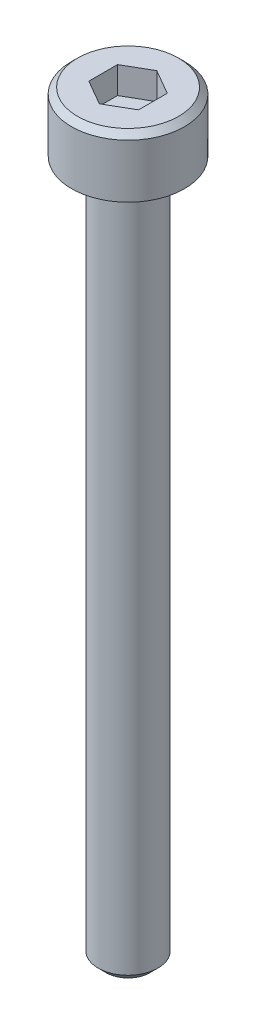
ISO-10303-21;
HEADER;
FILE_DESCRIPTION(('STEP AP214'),'2;1');
FILE_NAME('part.step','',(''),(''),'','','');
FILE_SCHEMA(('AUTOMOTIVE_DESIGN { 1 0 10303 214 1 1 1 1 }'));
ENDSEC;
DATA;
#1=APPLICATION_CONTEXT('core data for automotive mechanical design processes');
#2=APPLICATION_PROTOCOL_DEFINITION('international standard','automotive_design',2000,#1);
#3=PRODUCT_CONTEXT('',#1,'mechanical');
#4=PRODUCT('Part','Part','',(#3));
#5=PRODUCT_RELATED_PRODUCT_CATEGORY('part','',(#4));
#6=PRODUCT_DEFINITION_FORMATION('','',#4);
#7=PRODUCT_DEFINITION_CONTEXT('part definition',#1,'design');
#8=PRODUCT_DEFINITION('design','',#6,#7);
#9=PRODUCT_DEFINITION_SHAPE('','',#8);
#10=(LENGTH_UNIT() NAMED_UNIT(*) SI_UNIT(.MILLI.,.METRE.));
#11=(NAMED_UNIT(*) PLANE_ANGLE_UNIT() SI_UNIT($,.RADIAN.));
#12=(NAMED_UNIT(*) SI_UNIT($,.STERADIAN.) SOLID_ANGLE_UNIT());
#13=UNCERTAINTY_MEASURE_WITH_UNIT(LENGTH_MEASURE(1.E-05),#10,'distance_accuracy_value','');
#14=(GEOMETRIC_REPRESENTATION_CONTEXT(3) GLOBAL_UNCERTAINTY_ASSIGNED_CONTEXT((#13)) GLOBAL_UNIT_ASSIGNED_CONTEXT((#10,
#11,#12)) REPRESENTATION_CONTEXT('',''));
#15=CARTESIAN_POINT('',(0.,0.,0.));
#16=DIRECTION('',(0.,0.,1.));
#17=DIRECTION('',(1.,0.,0.));
#18=AXIS2_PLACEMENT_3D('',#15,#16,#17);
#19=CARTESIAN_POINT('',(0.,-35.,0.));
#20=DIRECTION('',(0.,-1.,0.));
#21=DIRECTION('',(0.,0.,-1.));
#22=AXIS2_PLACEMENT_3D('',#19,#20,#21);
#23=PLANE('',#22);
#24=CARTESIAN_POINT('',(0.,-35.,0.));
#25=DIRECTION('',(0.,-1.,0.));
#26=DIRECTION('',(0.,0.,-1.));
#27=AXIS2_PLACEMENT_3D('',#24,#25,#26);
#28=CIRCLE('',#27,1.1);
#29=CARTESIAN_POINT('',(0.,-35.,-1.1));
#30=VERTEX_POINT('',#29);
#31=EDGE_CURVE('E11',#30,#30,#28,.T.);
#32=ORIENTED_EDGE('',*,*,#31,.T.);
#33=EDGE_LOOP('',(#32));
#34=FACE_BOUND('',#33,.T.);
#35=ADVANCED_FACE('F41',(#34),#23,.T.);
#36=CARTESIAN_POINT('',(0.,-35.,0.));
#37=DIRECTION('',(0.,1.,0.));
#38=DIRECTION('',(0.,0.,1.));
#39=AXIS2_PLACEMENT_3D('',#36,#37,#38);
#40=CONICAL_SURFACE('',#39,1.1,0.785398163397451);
#41=CARTESIAN_POINT('',(0.,-34.6,0.));
#42=DIRECTION('',(0.,-1.,0.));
#43=DIRECTION('',(0.,0.,-1.));
#44=AXIS2_PLACEMENT_3D('',#41,#42,#43);
#45=CIRCLE('',#44,1.5);
#46=CARTESIAN_POINT('',(0.,-34.6,-1.5));
#47=VERTEX_POINT('',#46);
#48=EDGE_CURVE('E48',#47,#47,#45,.T.);
#49=ORIENTED_EDGE('',*,*,#48,.T.);
#50=EDGE_LOOP('',(#49));
#51=FACE_BOUND('',#50,.T.);
#52=ORIENTED_EDGE('',*,*,#31,.F.);
#53=EDGE_LOOP('',(#52));
#54=FACE_BOUND('',#53,.T.);
#55=ADVANCED_FACE('F161',(#51,#54),#40,.T.);
#56=CARTESIAN_POINT('',(0.,-10.,0.));
#57=DIRECTION('',(0.,-1.,0.));
#58=DIRECTION('',(0.,0.,-1.));
#59=AXIS2_PLACEMENT_3D('',#56,#57,#58);
#60=CYLINDRICAL_SURFACE('',#59,1.5);
#61=CARTESIAN_POINT('',(0.,0.,0.));
#62=DIRECTION('',(0.,-1.,0.));
#63=DIRECTION('',(0.,0.,-1.));
#64=AXIS2_PLACEMENT_3D('',#61,#62,#63);
#65=CIRCLE('',#64,1.5);
#66=CARTESIAN_POINT('',(0.,0.,-1.5));
#67=VERTEX_POINT('',#66);
#68=EDGE_CURVE('E156',#67,#67,#65,.T.);
#69=ORIENTED_EDGE('',*,*,#68,.T.);
#70=EDGE_LOOP('',(#69));
#71=FACE_BOUND('',#70,.T.);
#72=ORIENTED_EDGE('',*,*,#48,.F.);
#73=EDGE_LOOP('',(#72));
#74=FACE_BOUND('',#73,.T.);
#75=ADVANCED_FACE('F164',(#71,#74),#60,.T.);
#76=CARTESIAN_POINT('',(1.5,0.,0.));
#77=DIRECTION('',(0.,-1.,0.));
#78=DIRECTION('',(0.,0.,-1.));
#79=AXIS2_PLACEMENT_3D('',#76,#77,#78);
#80=PLANE('',#79);
#81=CARTESIAN_POINT('',(0.,0.,0.));
#82=DIRECTION('',(0.,-1.,0.));
#83=DIRECTION('',(0.,0.,-1.));
#84=AXIS2_PLACEMENT_3D('',#81,#82,#83);
#85=CIRCLE('',#84,2.84);
#86=CARTESIAN_POINT('',(0.,0.,-2.84));
#87=VERTEX_POINT('',#86);
#88=EDGE_CURVE('E153',#87,#87,#85,.T.);
#89=ORIENTED_EDGE('',*,*,#88,.T.);
#90=EDGE_LOOP('',(#89));
#91=FACE_BOUND('',#90,.T.);
#92=ORIENTED_EDGE('',*,*,#68,.F.);
#93=EDGE_LOOP('',(#92));
#94=FACE_BOUND('',#93,.T.);
#95=ADVANCED_FACE('F166',(#91,#94),#80,.T.);
#96=CARTESIAN_POINT('',(0.,-10.,0.));
#97=DIRECTION('',(0.,-1.,0.));
#98=DIRECTION('',(0.,0.,-1.));
#99=AXIS2_PLACEMENT_3D('',#96,#97,#98);
#100=CYLINDRICAL_SURFACE('',#99,2.84);
#101=CARTESIAN_POINT('',(0.,2.7,0.));
#102=DIRECTION('',(0.,-1.,0.));
#103=DIRECTION('',(0.,0.,-1.));
#104=AXIS2_PLACEMENT_3D('',#101,#102,#103);
#105=CIRCLE('',#104,2.84);
#106=CARTESIAN_POINT('',(0.,2.7,-2.84));
#107=VERTEX_POINT('',#106);
#108=EDGE_CURVE('E150',#107,#107,#105,.T.);
#109=ORIENTED_EDGE('',*,*,#108,.T.);
#110=EDGE_LOOP('',(#109));
#111=FACE_BOUND('',#110,.T.);
#112=ORIENTED_EDGE('',*,*,#88,.F.);
#113=EDGE_LOOP('',(#112));
#114=FACE_BOUND('',#113,.T.);
#115=ADVANCED_FACE('F172',(#111,#114),#100,.T.);
#116=CARTESIAN_POINT('',(0.,2.7,0.));
#117=DIRECTION('',(0.,-1.,0.));
#118=DIRECTION('',(0.,0.,-1.));
#119=AXIS2_PLACEMENT_3D('',#116,#117,#118);
#120=CONICAL_SURFACE('',#119,2.84,0.785398163397445);
#121=CARTESIAN_POINT('',(0.,3.,0.));
#122=DIRECTION('',(0.,-1.,0.));
#123=DIRECTION('',(0.,0.,-1.));
#124=AXIS2_PLACEMENT_3D('',#121,#122,#123);
#125=CIRCLE('',#124,2.54);
#126=CARTESIAN_POINT('',(0.,3.,-2.54));
#127=VERTEX_POINT('',#126);
#128=EDGE_CURVE('E142',#127,#127,#125,.T.);
#129=ORIENTED_EDGE('',*,*,#128,.T.);
#130=EDGE_LOOP('',(#129));
#131=FACE_BOUND('',#130,.T.);
#132=ORIENTED_EDGE('',*,*,#108,.F.);
#133=EDGE_LOOP('',(#132));
#134=FACE_BOUND('',#133,.T.);
#135=ADVANCED_FACE('F207',(#131,#134),#120,.T.);
#136=CARTESIAN_POINT('',(2.54,3.,0.));
#137=DIRECTION('',(0.,1.,0.));
#138=DIRECTION('',(0.,0.,1.));
#139=AXIS2_PLACEMENT_3D('',#136,#137,#138);
#140=PLANE('',#139);
#141=DIRECTION('',(0.,0.,-1.));
#142=VECTOR('',#141,1.);
#143=CARTESIAN_POINT('',(1.25,3.,-0.721687836487032));
#144=LINE('',#143,#142);
#145=CARTESIAN_POINT('',(1.25,3.,0.721687836487032));
#146=VERTEX_POINT('',#145);
#147=CARTESIAN_POINT('',(1.25,3.,-0.721687836487032));
#148=VERTEX_POINT('',#147);
#149=EDGE_CURVE('E55',#146,#148,#144,.T.);
#150=ORIENTED_EDGE('',*,*,#149,.F.);
#151=DIRECTION('',(0.866025403784439,0.,-0.5));
#152=VECTOR('',#151,1.);
#153=CARTESIAN_POINT('',(1.25,3.,0.721687836487032));
#154=LINE('',#153,#152);
#155=CARTESIAN_POINT('',(0.,3.,1.44337567297406));
#156=VERTEX_POINT('',#155);
#157=EDGE_CURVE('E138',#156,#146,#154,.T.);
#158=ORIENTED_EDGE('',*,*,#157,.F.);
#159=DIRECTION('',(0.866025403784439,0.,0.5));
#160=VECTOR('',#159,1.);
#161=CARTESIAN_POINT('',(0.,3.,1.44337567297406));
#162=LINE('',#161,#160);
#163=CARTESIAN_POINT('',(-1.25,3.,0.721687836487033));
#164=VERTEX_POINT('',#163);
#165=EDGE_CURVE('E136',#164,#156,#162,.T.);
#166=ORIENTED_EDGE('',*,*,#165,.F.);
#167=DIRECTION('',(0.,0.,1.));
#168=VECTOR('',#167,1.);
#169=CARTESIAN_POINT('',(-1.25,3.,0.721687836487033));
#170=LINE('',#169,#168);
#171=CARTESIAN_POINT('',(-1.25,3.,-0.721687836487032));
#172=VERTEX_POINT('',#171);
#173=EDGE_CURVE('E103',#172,#164,#170,.T.);
#174=ORIENTED_EDGE('',*,*,#173,.F.);
#175=DIRECTION('',(-0.866025403784438,0.,0.5));
#176=VECTOR('',#175,1.);
#177=CARTESIAN_POINT('',(-1.25,3.,-0.721687836487032));
#178=LINE('',#177,#176);
#179=CARTESIAN_POINT('',(0.,3.,-1.44337567297406));
#180=VERTEX_POINT('',#179);
#181=EDGE_CURVE('E132',#180,#172,#178,.T.);
#182=ORIENTED_EDGE('',*,*,#181,.F.);
#183=DIRECTION('',(-0.866025403784439,0.,-0.5));
#184=VECTOR('',#183,1.);
#185=CARTESIAN_POINT('',(0.,3.,-1.44337567297406));
#186=LINE('',#185,#184);
#187=EDGE_CURVE('E129',#148,#180,#186,.T.);
#188=ORIENTED_EDGE('',*,*,#187,.F.);
#189=EDGE_LOOP('',(#150,#158,#166,#174,#182,#188));
#190=FACE_BOUND('',#189,.T.);
#191=ORIENTED_EDGE('',*,*,#128,.F.);
#192=EDGE_LOOP('',(#191));
#193=FACE_BOUND('',#192,.T.);
#194=ADVANCED_FACE('F216',(#190,#193),#140,.T.);
#195=CARTESIAN_POINT('',(1.25,1.65,-0.721687836487032));
#196=DIRECTION('',(1.,0.,0.));
#197=DIRECTION('',(0.,0.,-1.));
#198=AXIS2_PLACEMENT_3D('',#195,#196,#197);
#199=PLANE('',#198);
#200=ORIENTED_EDGE('',*,*,#149,.T.);
#201=DIRECTION('',(0.,1.,0.));
#202=VECTOR('',#201,1.);
#203=CARTESIAN_POINT('',(1.25,1.65,-0.721687836487032));
#204=LINE('',#203,#202);
#205=CARTESIAN_POINT('',(1.25,1.65,-0.721687836487032));
#206=VERTEX_POINT('',#205);
#207=EDGE_CURVE('E85',#206,#148,#204,.T.);
#208=ORIENTED_EDGE('',*,*,#207,.F.);
#209=DIRECTION('',(0.,0.,-1.));
#210=VECTOR('',#209,1.);
#211=CARTESIAN_POINT('',(1.25,1.65,-0.721687836487032));
#212=LINE('',#211,#210);
#213=CARTESIAN_POINT('',(1.25,1.65,0.721687836487032));
#214=VERTEX_POINT('',#213);
#215=EDGE_CURVE('E140',#214,#206,#212,.T.);
#216=ORIENTED_EDGE('',*,*,#215,.F.);
#217=DIRECTION('',(0.,1.,0.));
#218=VECTOR('',#217,1.);
#219=CARTESIAN_POINT('',(1.25,1.65,0.721687836487032));
#220=LINE('',#219,#218);
#221=EDGE_CURVE('E63',#214,#146,#220,.T.);
#222=ORIENTED_EDGE('',*,*,#221,.T.);
#223=EDGE_LOOP('',(#200,#208,#216,#222));
#224=FACE_BOUND('',#223,.T.);
#225=ADVANCED_FACE('F225',(#224),#199,.F.);
#226=CARTESIAN_POINT('',(1.25,1.65,0.721687836487032));
#227=DIRECTION('',(0.5,0.,0.866025403784439));
#228=DIRECTION('',(0.866025403784439,0.,-0.5));
#229=AXIS2_PLACEMENT_3D('',#226,#227,#228);
#230=PLANE('',#229);
#231=ORIENTED_EDGE('',*,*,#157,.T.);
#232=ORIENTED_EDGE('',*,*,#221,.F.);
#233=DIRECTION('',(0.866025403784439,0.,-0.5));
#234=VECTOR('',#233,1.);
#235=CARTESIAN_POINT('',(1.25,1.65,0.721687836487032));
#236=LINE('',#235,#234);
#237=CARTESIAN_POINT('',(0.,1.65,1.44337567297406));
#238=VERTEX_POINT('',#237);
#239=EDGE_CURVE('E115',#238,#214,#236,.T.);
#240=ORIENTED_EDGE('',*,*,#239,.F.);
#241=DIRECTION('',(0.,1.,0.));
#242=VECTOR('',#241,1.);
#243=CARTESIAN_POINT('',(0.,1.65,1.44337567297406));
#244=LINE('',#243,#242);
#245=EDGE_CURVE('E107',#238,#156,#244,.T.);
#246=ORIENTED_EDGE('',*,*,#245,.T.);
#247=EDGE_LOOP('',(#231,#232,#240,#246));
#248=FACE_BOUND('',#247,.T.);
#249=ADVANCED_FACE('F234',(#248),#230,.F.);
#250=CARTESIAN_POINT('',(0.,1.65,1.44337567297406));
#251=DIRECTION('',(-0.5,0.,0.866025403784439));
#252=DIRECTION('',(0.866025403784439,0.,0.5));
#253=AXIS2_PLACEMENT_3D('',#250,#251,#252);
#254=PLANE('',#253);
#255=ORIENTED_EDGE('',*,*,#165,.T.);
#256=ORIENTED_EDGE('',*,*,#245,.F.);
#257=DIRECTION('',(0.866025403784439,0.,0.5));
#258=VECTOR('',#257,1.);
#259=CARTESIAN_POINT('',(0.,1.65,1.44337567297406));
#260=LINE('',#259,#258);
#261=CARTESIAN_POINT('',(-1.25,1.65,0.721687836487033));
#262=VERTEX_POINT('',#261);
#263=EDGE_CURVE('E111',#262,#238,#260,.T.);
#264=ORIENTED_EDGE('',*,*,#263,.F.);
#265=DIRECTION('',(0.,1.,0.));
#266=VECTOR('',#265,1.);
#267=CARTESIAN_POINT('',(-1.25,1.65,0.721687836487033));
#268=LINE('',#267,#266);
#269=EDGE_CURVE('E96',#262,#164,#268,.T.);
#270=ORIENTED_EDGE('',*,*,#269,.T.);
#271=EDGE_LOOP('',(#255,#256,#264,#270));
#272=FACE_BOUND('',#271,.T.);
#273=ADVANCED_FACE('F112',(#272),#254,.F.);
#274=CARTESIAN_POINT('',(-1.25,1.65,0.721687836487033));
#275=DIRECTION('',(-1.,0.,0.));
#276=DIRECTION('',(0.,0.,1.));
#277=AXIS2_PLACEMENT_3D('',#274,#275,#276);
#278=PLANE('',#277);
#279=ORIENTED_EDGE('',*,*,#173,.T.);
#280=ORIENTED_EDGE('',*,*,#269,.F.);
#281=DIRECTION('',(0.,0.,1.));
#282=VECTOR('',#281,1.);
#283=CARTESIAN_POINT('',(-1.25,1.65,0.721687836487033));
#284=LINE('',#283,#282);
#285=CARTESIAN_POINT('',(-1.25,1.65,-0.721687836487032));
#286=VERTEX_POINT('',#285);
#287=EDGE_CURVE('E100',#286,#262,#284,.T.);
#288=ORIENTED_EDGE('',*,*,#287,.F.);
#289=DIRECTION('',(0.,1.,0.));
#290=VECTOR('',#289,1.);
#291=CARTESIAN_POINT('',(-1.25,1.65,-0.721687836487032));
#292=LINE('',#291,#290);
#293=EDGE_CURVE('E108',#286,#172,#292,.T.);
#294=ORIENTED_EDGE('',*,*,#293,.T.);
#295=EDGE_LOOP('',(#279,#280,#288,#294));
#296=FACE_BOUND('',#295,.T.);
#297=ADVANCED_FACE('F98',(#296),#278,.F.);
#298=CARTESIAN_POINT('',(-1.25,1.65,-0.721687836487032));
#299=DIRECTION('',(-0.5,0.,-0.866025403784438));
#300=DIRECTION('',(-0.866025403784439,0.,0.5));
#301=AXIS2_PLACEMENT_3D('',#298,#299,#300);
#302=PLANE('',#301);
#303=ORIENTED_EDGE('',*,*,#181,.T.);
#304=ORIENTED_EDGE('',*,*,#293,.F.);
#305=DIRECTION('',(-0.866025403784438,0.,0.5));
#306=VECTOR('',#305,1.);
#307=CARTESIAN_POINT('',(-1.25,1.65,-0.721687836487032));
#308=LINE('',#307,#306);
#309=CARTESIAN_POINT('',(0.,1.65,-1.44337567297406));
#310=VERTEX_POINT('',#309);
#311=EDGE_CURVE('E121',#310,#286,#308,.T.);
#312=ORIENTED_EDGE('',*,*,#311,.F.);
#313=DIRECTION('',(0.,1.,0.));
#314=VECTOR('',#313,1.);
#315=CARTESIAN_POINT('',(0.,1.65,-1.44337567297406));
#316=LINE('',#315,#314);
#317=EDGE_CURVE('E145',#310,#180,#316,.T.);
#318=ORIENTED_EDGE('',*,*,#317,.T.);
#319=EDGE_LOOP('',(#303,#304,#312,#318));
#320=FACE_BOUND('',#319,.T.);
#321=ADVANCED_FACE('F256',(#320),#302,.F.);
#322=CARTESIAN_POINT('',(0.,1.65,-1.44337567297406));
#323=DIRECTION('',(0.5,0.,-0.866025403784439));
#324=DIRECTION('',(-0.866025403784439,0.,-0.5));
#325=AXIS2_PLACEMENT_3D('',#322,#323,#324);
#326=PLANE('',#325);
#327=ORIENTED_EDGE('',*,*,#187,.T.);
#328=ORIENTED_EDGE('',*,*,#317,.F.);
#329=DIRECTION('',(-0.866025403784439,0.,-0.5));
#330=VECTOR('',#329,1.);
#331=CARTESIAN_POINT('',(0.,1.65,-1.44337567297406));
#332=LINE('',#331,#330);
#333=EDGE_CURVE('E123',#206,#310,#332,.T.);
#334=ORIENTED_EDGE('',*,*,#333,.F.);
#335=ORIENTED_EDGE('',*,*,#207,.T.);
#336=EDGE_LOOP('',(#327,#328,#334,#335));
#337=FACE_BOUND('',#336,.T.);
#338=ADVANCED_FACE('F264',(#337),#326,.F.);
#339=CARTESIAN_POINT('',(0.,1.65,0.));
#340=DIRECTION('',(0.,-1.,0.));
#341=DIRECTION('',(0.,0.,-1.));
#342=AXIS2_PLACEMENT_3D('',#339,#340,#341);
#343=PLANE('',#342);
#344=ORIENTED_EDGE('',*,*,#215,.T.);
#345=ORIENTED_EDGE('',*,*,#333,.T.);
#346=ORIENTED_EDGE('',*,*,#311,.T.);
#347=ORIENTED_EDGE('',*,*,#287,.T.);
#348=ORIENTED_EDGE('',*,*,#263,.T.);
#349=ORIENTED_EDGE('',*,*,#239,.T.);
#350=EDGE_LOOP('',(#344,#345,#346,#347,#348,#349));
#351=FACE_BOUND('',#350,.T.);
#352=ADVANCED_FACE('F118',(#351),#343,.F.);
#353=CLOSED_SHELL('',(#35,#55,#75,#95,#115,#135,#194,#225,#249,#273,#297,#321,#338,#352));
#354=MANIFOLD_SOLID_BREP('B2',#353);
#355=ADVANCED_BREP_SHAPE_REPRESENTATION('',(#18,#354),#14);
#356=SHAPE_DEFINITION_REPRESENTATION(#9,#355);
ENDSEC;
END-ISO-10303-21;
